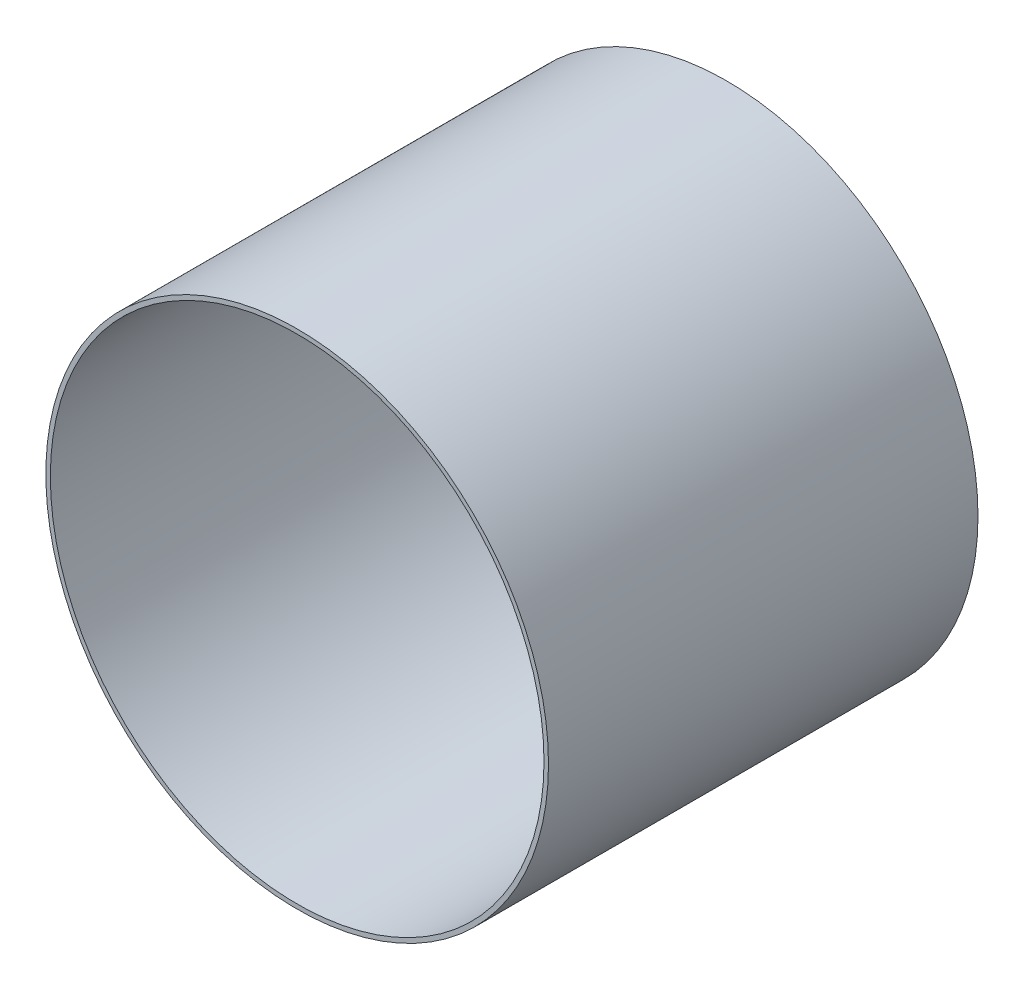
ISO-10303-21;
HEADER;
FILE_DESCRIPTION(('STEP AP214'),'2;1');
FILE_NAME('part.step','',(''),(''),'','','');
FILE_SCHEMA(('AUTOMOTIVE_DESIGN { 1 0 10303 214 1 1 1 1 }'));
ENDSEC;
DATA;
#1=APPLICATION_CONTEXT('core data for automotive mechanical design processes');
#2=APPLICATION_PROTOCOL_DEFINITION('international standard','automotive_design',2000,#1);
#3=PRODUCT_CONTEXT('',#1,'mechanical');
#4=PRODUCT('Part','Part','',(#3));
#5=PRODUCT_RELATED_PRODUCT_CATEGORY('part','',(#4));
#6=PRODUCT_DEFINITION_FORMATION('','',#4);
#7=PRODUCT_DEFINITION_CONTEXT('part definition',#1,'design');
#8=PRODUCT_DEFINITION('design','',#6,#7);
#9=PRODUCT_DEFINITION_SHAPE('','',#8);
#10=(LENGTH_UNIT() NAMED_UNIT(*) SI_UNIT(.MILLI.,.METRE.));
#11=(NAMED_UNIT(*) PLANE_ANGLE_UNIT() SI_UNIT($,.RADIAN.));
#12=(NAMED_UNIT(*) SI_UNIT($,.STERADIAN.) SOLID_ANGLE_UNIT());
#13=UNCERTAINTY_MEASURE_WITH_UNIT(LENGTH_MEASURE(1.E-05),#10,'distance_accuracy_value','');
#14=(GEOMETRIC_REPRESENTATION_CONTEXT(3) GLOBAL_UNCERTAINTY_ASSIGNED_CONTEXT((#13)) GLOBAL_UNIT_ASSIGNED_CONTEXT((#10,
#11,#12)) REPRESENTATION_CONTEXT('',''));
#15=CARTESIAN_POINT('',(0.,0.,0.));
#16=DIRECTION('',(0.,0.,1.));
#17=DIRECTION('',(1.,0.,0.));
#18=AXIS2_PLACEMENT_3D('',#15,#16,#17);
#19=CARTESIAN_POINT('',(0.,0.,121.539));
#20=DIRECTION('',(0.,0.,1.));
#21=DIRECTION('',(1.,0.,0.));
#22=AXIS2_PLACEMENT_3D('',#19,#20,#21);
#23=PLANE('',#22);
#24=CARTESIAN_POINT('',(0.,0.,121.539));
#25=DIRECTION('',(0.,0.,1.));
#26=DIRECTION('',(1.,0.,0.));
#27=AXIS2_PLACEMENT_3D('',#24,#25,#26);
#28=CIRCLE('',#27,71.12);
#29=CARTESIAN_POINT('',(71.12,0.,121.539));
#30=VERTEX_POINT('',#29);
#31=EDGE_CURVE('E10',#30,#30,#28,.T.);
#32=ORIENTED_EDGE('',*,*,#31,.T.);
#33=EDGE_LOOP('',(#32));
#34=FACE_BOUND('',#33,.T.);
#35=CARTESIAN_POINT('',(0.,0.,121.539));
#36=DIRECTION('',(0.,0.,1.));
#37=DIRECTION('',(1.,0.,0.));
#38=AXIS2_PLACEMENT_3D('',#35,#36,#37);
#39=CIRCLE('',#38,69.85);
#40=CARTESIAN_POINT('',(69.85,0.,121.539));
#41=VERTEX_POINT('',#40);
#42=EDGE_CURVE('E39',#41,#41,#39,.T.);
#43=ORIENTED_EDGE('',*,*,#42,.F.);
#44=EDGE_LOOP('',(#43));
#45=FACE_BOUND('',#44,.T.);
#46=ADVANCED_FACE('F28',(#34,#45),#23,.T.);
#47=CARTESIAN_POINT('',(0.,0.,0.));
#48=DIRECTION('',(0.,0.,1.));
#49=DIRECTION('',(1.,0.,0.));
#50=AXIS2_PLACEMENT_3D('',#47,#48,#49);
#51=PLANE('',#50);
#52=CARTESIAN_POINT('',(0.,0.,0.));
#53=DIRECTION('',(0.,0.,1.));
#54=DIRECTION('',(1.,0.,0.));
#55=AXIS2_PLACEMENT_3D('',#52,#53,#54);
#56=CIRCLE('',#55,71.12);
#57=CARTESIAN_POINT('',(71.12,0.,0.));
#58=VERTEX_POINT('',#57);
#59=EDGE_CURVE('E32',#58,#58,#56,.T.);
#60=ORIENTED_EDGE('',*,*,#59,.F.);
#61=EDGE_LOOP('',(#60));
#62=FACE_BOUND('',#61,.T.);
#63=CARTESIAN_POINT('',(0.,0.,0.));
#64=DIRECTION('',(0.,0.,1.));
#65=DIRECTION('',(1.,0.,0.));
#66=AXIS2_PLACEMENT_3D('',#63,#64,#65);
#67=CIRCLE('',#66,69.85);
#68=CARTESIAN_POINT('',(69.85,0.,0.));
#69=VERTEX_POINT('',#68);
#70=EDGE_CURVE('E41',#69,#69,#67,.T.);
#71=ORIENTED_EDGE('',*,*,#70,.T.);
#72=EDGE_LOOP('',(#71));
#73=FACE_BOUND('',#72,.T.);
#74=ADVANCED_FACE('F51',(#62,#73),#51,.F.);
#75=CARTESIAN_POINT('',(0.,0.,121.539));
#76=DIRECTION('',(0.,0.,-1.));
#77=DIRECTION('',(-1.,0.,0.));
#78=AXIS2_PLACEMENT_3D('',#75,#76,#77);
#79=CYLINDRICAL_SURFACE('',#78,71.12);
#80=ORIENTED_EDGE('',*,*,#31,.F.);
#81=EDGE_LOOP('',(#80));
#82=FACE_BOUND('',#81,.T.);
#83=ORIENTED_EDGE('',*,*,#59,.T.);
#84=EDGE_LOOP('',(#83));
#85=FACE_BOUND('',#84,.T.);
#86=ADVANCED_FACE('F30',(#82,#85),#79,.T.);
#87=CARTESIAN_POINT('',(0.,0.,121.539));
#88=DIRECTION('',(0.,0.,-1.));
#89=DIRECTION('',(-1.,0.,0.));
#90=AXIS2_PLACEMENT_3D('',#87,#88,#89);
#91=CYLINDRICAL_SURFACE('',#90,69.85);
#92=ORIENTED_EDGE('',*,*,#42,.T.);
#93=EDGE_LOOP('',(#92));
#94=FACE_BOUND('',#93,.T.);
#95=ORIENTED_EDGE('',*,*,#70,.F.);
#96=EDGE_LOOP('',(#95));
#97=FACE_BOUND('',#96,.T.);
#98=ADVANCED_FACE('F47',(#94,#97),#91,.F.);
#99=CLOSED_SHELL('',(#46,#74,#86,#98));
#100=MANIFOLD_SOLID_BREP('B2',#99);
#101=ADVANCED_BREP_SHAPE_REPRESENTATION('',(#18,#100),#14);
#102=SHAPE_DEFINITION_REPRESENTATION(#9,#101);
ENDSEC;
END-ISO-10303-21;
